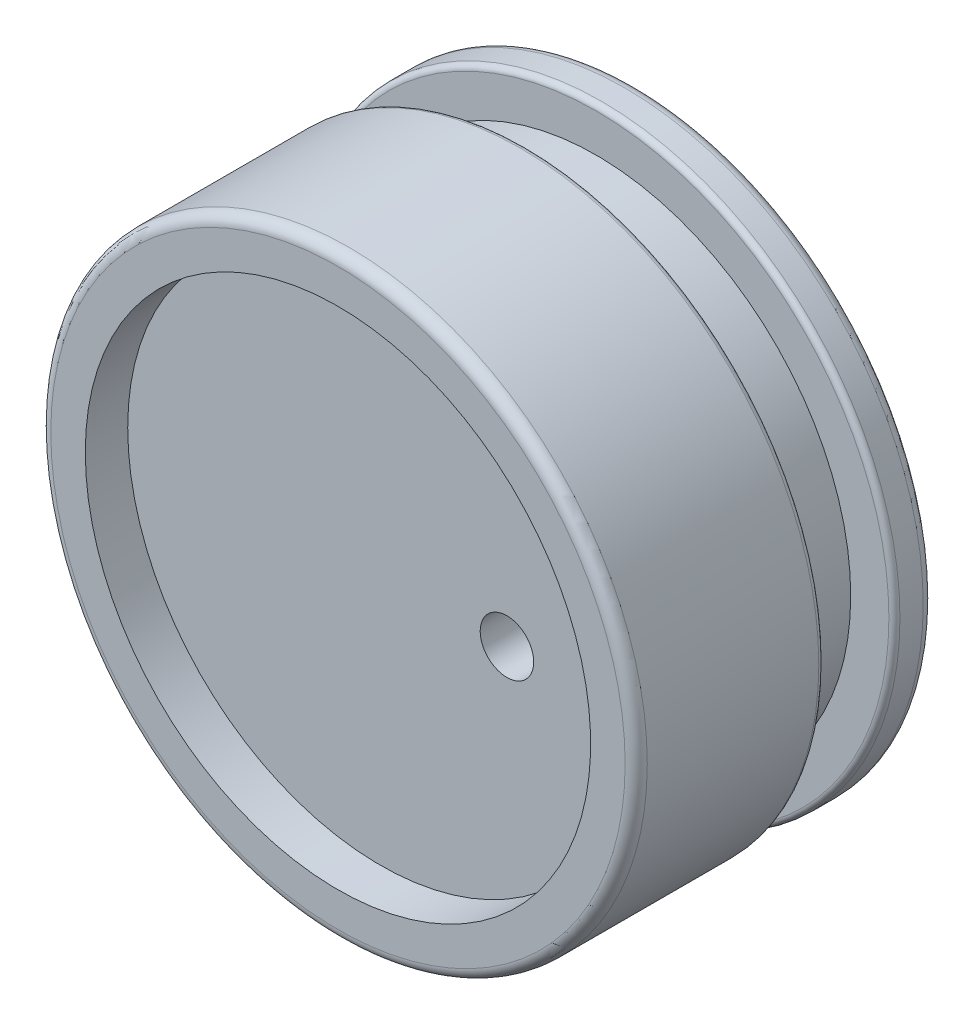
ISO-10303-21;
HEADER;
FILE_DESCRIPTION(('STEP AP214'),'2;1');
FILE_NAME('part.step','',(''),(''),'','','');
FILE_SCHEMA(('AUTOMOTIVE_DESIGN { 1 0 10303 214 1 1 1 1 }'));
ENDSEC;
DATA;
#1=APPLICATION_CONTEXT('core data for automotive mechanical design processes');
#2=APPLICATION_PROTOCOL_DEFINITION('international standard','automotive_design',2000,#1);
#3=PRODUCT_CONTEXT('',#1,'mechanical');
#4=PRODUCT('Part','Part','',(#3));
#5=PRODUCT_RELATED_PRODUCT_CATEGORY('part','',(#4));
#6=PRODUCT_DEFINITION_FORMATION('','',#4);
#7=PRODUCT_DEFINITION_CONTEXT('part definition',#1,'design');
#8=PRODUCT_DEFINITION('design','',#6,#7);
#9=PRODUCT_DEFINITION_SHAPE('','',#8);
#10=(LENGTH_UNIT() NAMED_UNIT(*) SI_UNIT(.MILLI.,.METRE.));
#11=(NAMED_UNIT(*) PLANE_ANGLE_UNIT() SI_UNIT($,.RADIAN.));
#12=(NAMED_UNIT(*) SI_UNIT($,.STERADIAN.) SOLID_ANGLE_UNIT());
#13=UNCERTAINTY_MEASURE_WITH_UNIT(LENGTH_MEASURE(1.E-05),#10,'distance_accuracy_value','');
#14=(GEOMETRIC_REPRESENTATION_CONTEXT(3) GLOBAL_UNCERTAINTY_ASSIGNED_CONTEXT((#13)) GLOBAL_UNIT_ASSIGNED_CONTEXT((#10,
#11,#12)) REPRESENTATION_CONTEXT('',''));
#15=CARTESIAN_POINT('',(0.,0.,0.));
#16=DIRECTION('',(0.,0.,1.));
#17=DIRECTION('',(1.,0.,0.));
#18=AXIS2_PLACEMENT_3D('',#15,#16,#17);
#19=CARTESIAN_POINT('',(8.7122,0.,3.2512));
#20=DIRECTION('',(0.,0.,1.));
#21=DIRECTION('',(0.,-1.,0.));
#22=AXIS2_PLACEMENT_3D('',#19,#20,#21);
#23=CONICAL_SURFACE('',#22,1.8415,1.02974425867666);
#24=CARTESIAN_POINT('',(8.7122,0.,2.14471517006075));
#25=VERTEX_POINT('',#24);
#26=VERTEX_LOOP('',#25);
#27=FACE_BOUND('',#26,.T.);
#28=CARTESIAN_POINT('',(8.7122,0.,3.2512));
#29=DIRECTION('',(0.,0.,1.));
#30=DIRECTION('',(0.,-1.,0.));
#31=AXIS2_PLACEMENT_3D('',#28,#29,#30);
#32=CIRCLE('',#31,1.8415);
#33=CARTESIAN_POINT('',(8.7122,-1.8415,3.2512));
#34=VERTEX_POINT('',#33);
#35=EDGE_CURVE('E354',#34,#34,#32,.T.);
#36=ORIENTED_EDGE('',*,*,#35,.T.);
#37=EDGE_LOOP('',(#36));
#38=FACE_BOUND('',#37,.T.);
#39=ADVANCED_FACE('F17',(#27,#38),#23,.F.);
#40=CARTESIAN_POINT('',(8.7122,0.,17.6022));
#41=DIRECTION('',(0.,0.,-1.));
#42=DIRECTION('',(-1.,0.,0.));
#43=AXIS2_PLACEMENT_3D('',#40,#41,#42);
#44=CYLINDRICAL_SURFACE('',#43,1.8415);
#45=CARTESIAN_POINT('',(8.7122,0.,17.6022));
#46=DIRECTION('',(0.,0.,-1.));
#47=DIRECTION('',(-1.,0.,0.));
#48=AXIS2_PLACEMENT_3D('',#45,#46,#47);
#49=CIRCLE('',#48,1.8415);
#50=CARTESIAN_POINT('',(6.8707,0.,17.6022));
#51=VERTEX_POINT('',#50);
#52=EDGE_CURVE('E361',#51,#51,#49,.T.);
#53=ORIENTED_EDGE('',*,*,#52,.F.);
#54=EDGE_LOOP('',(#53));
#55=FACE_BOUND('',#54,.T.);
#56=ORIENTED_EDGE('',*,*,#35,.F.);
#57=EDGE_LOOP('',(#56));
#58=FACE_BOUND('',#57,.T.);
#59=ADVANCED_FACE('F19',(#55,#58),#44,.F.);
#60=CARTESIAN_POINT('',(1.58172727272727,0.,17.6022));
#61=DIRECTION('',(0.,0.,1.));
#62=DIRECTION('',(1.,0.,0.));
#63=AXIS2_PLACEMENT_3D('',#60,#61,#62);
#64=PLANE('',#63);
#65=ORIENTED_EDGE('',*,*,#52,.T.);
#66=EDGE_LOOP('',(#65));
#67=FACE_BOUND('',#66,.T.);
#68=CARTESIAN_POINT('',(0.,0.,17.6022));
#69=DIRECTION('',(0.,0.,-1.));
#70=DIRECTION('',(-1.,0.,0.));
#71=AXIS2_PLACEMENT_3D('',#68,#69,#70);
#72=CIRCLE('',#71,17.399);
#73=CARTESIAN_POINT('',(-17.399,0.,17.6022));
#74=VERTEX_POINT('',#73);
#75=EDGE_CURVE('E358',#74,#74,#72,.F.);
#76=ORIENTED_EDGE('',*,*,#75,.T.);
#77=EDGE_LOOP('',(#76));
#78=FACE_BOUND('',#77,.T.);
#79=ADVANCED_FACE('F100',(#67,#78),#64,.T.);
#80=CARTESIAN_POINT('',(0.,0.,20.5232));
#81=DIRECTION('',(0.,0.,-1.));
#82=DIRECTION('',(-1.,0.,0.));
#83=AXIS2_PLACEMENT_3D('',#80,#81,#82);
#84=CYLINDRICAL_SURFACE('',#83,17.399);
#85=ORIENTED_EDGE('',*,*,#75,.F.);
#86=EDGE_LOOP('',(#85));
#87=FACE_BOUND('',#86,.T.);
#88=CARTESIAN_POINT('',(0.,0.,20.5232));
#89=DIRECTION('',(0.,0.,-1.));
#90=DIRECTION('',(-1.,0.,0.));
#91=AXIS2_PLACEMENT_3D('',#88,#89,#90);
#92=CIRCLE('',#91,17.399);
#93=CARTESIAN_POINT('',(-17.399,0.,20.5232));
#94=VERTEX_POINT('',#93);
#95=EDGE_CURVE('E70',#94,#94,#92,.T.);
#96=ORIENTED_EDGE('',*,*,#95,.F.);
#97=EDGE_LOOP('',(#96));
#98=FACE_BOUND('',#97,.T.);
#99=ADVANCED_FACE('F86',(#87,#98),#84,.F.);
#100=CARTESIAN_POINT('',(1.8669,0.,20.5232));
#101=DIRECTION('',(0.,0.,1.));
#102=DIRECTION('',(1.,0.,0.));
#103=AXIS2_PLACEMENT_3D('',#100,#101,#102);
#104=PLANE('',#103);
#105=ORIENTED_EDGE('',*,*,#95,.T.);
#106=EDGE_LOOP('',(#105));
#107=FACE_BOUND('',#106,.T.);
#108=CARTESIAN_POINT('',(0.,0.,20.5232));
#109=DIRECTION('',(0.,0.,-1.));
#110=DIRECTION('',(1.,0.,0.));
#111=AXIS2_PLACEMENT_3D('',#108,#109,#110);
#112=CIRCLE('',#111,19.7739);
#113=CARTESIAN_POINT('',(19.7739,0.,20.5232));
#114=VERTEX_POINT('',#113);
#115=CARTESIAN_POINT('',(-19.7739,0.,20.5232));
#116=VERTEX_POINT('',#115);
#117=EDGE_CURVE('E62',#114,#116,#112,.T.);
#118=ORIENTED_EDGE('',*,*,#117,.F.);
#119=CARTESIAN_POINT('',(0.,0.,20.5232));
#120=DIRECTION('',(0.,0.,-1.));
#121=DIRECTION('',(-1.,0.,0.));
#122=AXIS2_PLACEMENT_3D('',#119,#120,#121);
#123=CIRCLE('',#122,19.7739);
#124=EDGE_CURVE('E57',#116,#114,#123,.T.);
#125=ORIENTED_EDGE('',*,*,#124,.F.);
#126=EDGE_LOOP('',(#118,#125));
#127=FACE_BOUND('',#126,.T.);
#128=ADVANCED_FACE('F69',(#107,#127),#104,.T.);
#129=CARTESIAN_POINT('',(0.,0.,19.7612));
#130=DIRECTION('',(0.,0.,-1.));
#131=DIRECTION('',(-1.,0.,0.));
#132=AXIS2_PLACEMENT_3D('',#129,#130,#131);
#133=TOROIDAL_SURFACE('',#132,19.7739,0.762);
#134=ORIENTED_EDGE('',*,*,#117,.T.);
#135=ORIENTED_EDGE('',*,*,#124,.T.);
#136=EDGE_LOOP('',(#134,#135));
#137=FACE_BOUND('',#136,.T.);
#138=CARTESIAN_POINT('',(0.,0.,19.7612));
#139=DIRECTION('',(0.,0.,1.));
#140=DIRECTION('',(1.,0.,0.));
#141=AXIS2_PLACEMENT_3D('',#138,#139,#140);
#142=CIRCLE('',#141,20.5359);
#143=CARTESIAN_POINT('',(20.5359,0.,19.7612));
#144=VERTEX_POINT('',#143);
#145=EDGE_CURVE('E65',#144,#144,#142,.F.);
#146=ORIENTED_EDGE('',*,*,#145,.F.);
#147=EDGE_LOOP('',(#146));
#148=FACE_BOUND('',#147,.T.);
#149=ADVANCED_FACE('F60',(#137,#148),#133,.T.);
#150=CARTESIAN_POINT('',(0.,0.,7.5692));
#151=DIRECTION('',(0.,0.,1.));
#152=DIRECTION('',(1.,0.,0.));
#153=AXIS2_PLACEMENT_3D('',#150,#151,#152);
#154=CYLINDRICAL_SURFACE('',#153,20.5359);
#155=ORIENTED_EDGE('',*,*,#145,.T.);
#156=EDGE_LOOP('',(#155));
#157=FACE_BOUND('',#156,.T.);
#158=CARTESIAN_POINT('',(0.,0.,7.9502));
#159=DIRECTION('',(0.,0.,-1.));
#160=DIRECTION('',(-1.,0.,0.));
#161=AXIS2_PLACEMENT_3D('',#158,#159,#160);
#162=CIRCLE('',#161,20.5359);
#163=CARTESIAN_POINT('',(-20.5359,0.,7.9502));
#164=VERTEX_POINT('',#163);
#165=EDGE_CURVE('E223',#164,#164,#162,.T.);
#166=ORIENTED_EDGE('',*,*,#165,.F.);
#167=EDGE_LOOP('',(#166));
#168=FACE_BOUND('',#167,.T.);
#169=ADVANCED_FACE('F208',(#157,#168),#154,.T.);
#170=CARTESIAN_POINT('',(0.,0.,7.9502));
#171=DIRECTION('',(0.,0.,-1.));
#172=DIRECTION('',(-1.,0.,0.));
#173=AXIS2_PLACEMENT_3D('',#170,#171,#172);
#174=TOROIDAL_SURFACE('',#173,20.1549,0.381);
#175=ORIENTED_EDGE('',*,*,#165,.T.);
#176=EDGE_LOOP('',(#175));
#177=FACE_BOUND('',#176,.T.);
#178=CARTESIAN_POINT('',(0.,0.,7.5692));
#179=DIRECTION('',(0.,0.,1.));
#180=DIRECTION('',(1.,0.,0.));
#181=AXIS2_PLACEMENT_3D('',#178,#179,#180);
#182=CIRCLE('',#181,20.1549);
#183=CARTESIAN_POINT('',(20.1549,0.,7.5692));
#184=VERTEX_POINT('',#183);
#185=CARTESIAN_POINT('',(-20.1549,0.,7.5692));
#186=VERTEX_POINT('',#185);
#187=EDGE_CURVE('E219',#184,#186,#182,.T.);
#188=ORIENTED_EDGE('',*,*,#187,.T.);
#189=CARTESIAN_POINT('',(0.,0.,7.5692));
#190=DIRECTION('',(0.,0.,1.));
#191=DIRECTION('',(-1.,0.,0.));
#192=AXIS2_PLACEMENT_3D('',#189,#190,#191);
#193=CIRCLE('',#192,20.1549);
#194=EDGE_CURVE('E193',#186,#184,#193,.T.);
#195=ORIENTED_EDGE('',*,*,#194,.T.);
#196=EDGE_LOOP('',(#188,#195));
#197=FACE_BOUND('',#196,.T.);
#198=ADVANCED_FACE('F197',(#177,#197),#174,.T.);
#199=CARTESIAN_POINT('',(1.8669,0.,7.5692));
#200=DIRECTION('',(0.,0.,1.));
#201=DIRECTION('',(1.,0.,0.));
#202=AXIS2_PLACEMENT_3D('',#199,#200,#201);
#203=PLANE('',#202);
#204=CARTESIAN_POINT('',(0.,0.,7.5692));
#205=DIRECTION('',(0.,0.,1.));
#206=DIRECTION('',(1.,0.,0.));
#207=AXIS2_PLACEMENT_3D('',#204,#205,#206);
#208=CIRCLE('',#207,17.526);
#209=CARTESIAN_POINT('',(17.526,0.,7.5692));
#210=VERTEX_POINT('',#209);
#211=EDGE_CURVE('E349',#210,#210,#208,.F.);
#212=ORIENTED_EDGE('',*,*,#211,.F.);
#213=EDGE_LOOP('',(#212));
#214=FACE_BOUND('',#213,.T.);
#215=ORIENTED_EDGE('',*,*,#194,.F.);
#216=ORIENTED_EDGE('',*,*,#187,.F.);
#217=EDGE_LOOP('',(#215,#216));
#218=FACE_BOUND('',#217,.T.);
#219=ADVANCED_FACE('F207',(#214,#218),#203,.F.);
#220=CARTESIAN_POINT('',(0.,0.,2.7432));
#221=DIRECTION('',(0.,0.,1.));
#222=DIRECTION('',(1.,0.,0.));
#223=AXIS2_PLACEMENT_3D('',#220,#221,#222);
#224=CYLINDRICAL_SURFACE('',#223,17.526);
#225=ORIENTED_EDGE('',*,*,#211,.T.);
#226=EDGE_LOOP('',(#225));
#227=FACE_BOUND('',#226,.T.);
#228=CARTESIAN_POINT('',(0.,0.,2.7432));
#229=DIRECTION('',(0.,0.,1.));
#230=DIRECTION('',(1.,0.,0.));
#231=AXIS2_PLACEMENT_3D('',#228,#229,#230);
#232=CIRCLE('',#231,17.526);
#233=CARTESIAN_POINT('',(17.526,0.,2.7432));
#234=VERTEX_POINT('',#233);
#235=EDGE_CURVE('E345',#234,#234,#232,.F.);
#236=ORIENTED_EDGE('',*,*,#235,.F.);
#237=EDGE_LOOP('',(#236));
#238=FACE_BOUND('',#237,.T.);
#239=ADVANCED_FACE('F252',(#227,#238),#224,.T.);
#240=CARTESIAN_POINT('',(1.8669,0.,2.7432));
#241=DIRECTION('',(0.,0.,1.));
#242=DIRECTION('',(1.,0.,0.));
#243=AXIS2_PLACEMENT_3D('',#240,#241,#242);
#244=PLANE('',#243);
#245=ORIENTED_EDGE('',*,*,#235,.T.);
#246=EDGE_LOOP('',(#245));
#247=FACE_BOUND('',#246,.T.);
#248=CARTESIAN_POINT('',(0.,0.,2.7432));
#249=DIRECTION('',(0.,0.,-1.));
#250=DIRECTION('',(1.,0.,0.));
#251=AXIS2_PLACEMENT_3D('',#248,#249,#250);
#252=CIRCLE('',#251,20.1549);
#253=CARTESIAN_POINT('',(20.1549,0.,2.7432));
#254=VERTEX_POINT('',#253);
#255=CARTESIAN_POINT('',(-20.1549,0.,2.7432));
#256=VERTEX_POINT('',#255);
#257=EDGE_CURVE('E347',#254,#256,#252,.T.);
#258=ORIENTED_EDGE('',*,*,#257,.F.);
#259=CARTESIAN_POINT('',(0.,0.,2.7432));
#260=DIRECTION('',(0.,0.,-1.));
#261=DIRECTION('',(-1.,0.,0.));
#262=AXIS2_PLACEMENT_3D('',#259,#260,#261);
#263=CIRCLE('',#262,20.1549);
#264=EDGE_CURVE('E158',#256,#254,#263,.T.);
#265=ORIENTED_EDGE('',*,*,#264,.F.);
#266=EDGE_LOOP('',(#258,#265));
#267=FACE_BOUND('',#266,.T.);
#268=ADVANCED_FACE('F168',(#247,#267),#244,.T.);
#269=CARTESIAN_POINT('',(0.,0.,2.3622));
#270=DIRECTION('',(0.,0.,-1.));
#271=DIRECTION('',(-1.,0.,0.));
#272=AXIS2_PLACEMENT_3D('',#269,#270,#271);
#273=TOROIDAL_SURFACE('',#272,20.1549,0.381);
#274=ORIENTED_EDGE('',*,*,#257,.T.);
#275=ORIENTED_EDGE('',*,*,#264,.T.);
#276=EDGE_LOOP('',(#274,#275));
#277=FACE_BOUND('',#276,.T.);
#278=CARTESIAN_POINT('',(0.,0.,2.3622));
#279=DIRECTION('',(0.,0.,1.));
#280=DIRECTION('',(1.,0.,0.));
#281=AXIS2_PLACEMENT_3D('',#278,#279,#280);
#282=CIRCLE('',#281,20.5359);
#283=CARTESIAN_POINT('',(20.5359,0.,2.3622));
#284=VERTEX_POINT('',#283);
#285=EDGE_CURVE('E155',#284,#284,#282,.F.);
#286=ORIENTED_EDGE('',*,*,#285,.F.);
#287=EDGE_LOOP('',(#286));
#288=FACE_BOUND('',#287,.T.);
#289=ADVANCED_FACE('F164',(#277,#288),#273,.T.);
#290=CARTESIAN_POINT('',(0.,0.,0.));
#291=DIRECTION('',(0.,0.,1.));
#292=DIRECTION('',(1.,0.,0.));
#293=AXIS2_PLACEMENT_3D('',#290,#291,#292);
#294=CYLINDRICAL_SURFACE('',#293,20.5359);
#295=ORIENTED_EDGE('',*,*,#285,.T.);
#296=EDGE_LOOP('',(#295));
#297=FACE_BOUND('',#296,.T.);
#298=CARTESIAN_POINT('',(0.,0.,0.762));
#299=DIRECTION('',(0.,0.,-1.));
#300=DIRECTION('',(-1.,0.,0.));
#301=AXIS2_PLACEMENT_3D('',#298,#299,#300);
#302=CIRCLE('',#301,20.5359);
#303=CARTESIAN_POINT('',(-20.5359,0.,0.762));
#304=VERTEX_POINT('',#303);
#305=EDGE_CURVE('E147',#304,#304,#302,.T.);
#306=ORIENTED_EDGE('',*,*,#305,.F.);
#307=EDGE_LOOP('',(#306));
#308=FACE_BOUND('',#307,.T.);
#309=ADVANCED_FACE('F120',(#297,#308),#294,.T.);
#310=CARTESIAN_POINT('',(0.,0.,0.762));
#311=DIRECTION('',(0.,0.,-1.));
#312=DIRECTION('',(-1.,0.,0.));
#313=AXIS2_PLACEMENT_3D('',#310,#311,#312);
#314=TOROIDAL_SURFACE('',#313,19.7739,0.762);
#315=ORIENTED_EDGE('',*,*,#305,.T.);
#316=EDGE_LOOP('',(#315));
#317=FACE_BOUND('',#316,.T.);
#318=CARTESIAN_POINT('',(0.,0.,0.));
#319=DIRECTION('',(0.,0.,1.));
#320=DIRECTION('',(1.,0.,0.));
#321=AXIS2_PLACEMENT_3D('',#318,#319,#320);
#322=CIRCLE('',#321,19.7739);
#323=CARTESIAN_POINT('',(19.7739,0.,0.));
#324=VERTEX_POINT('',#323);
#325=CARTESIAN_POINT('',(-19.7739,0.,0.));
#326=VERTEX_POINT('',#325);
#327=EDGE_CURVE('E11',#324,#326,#322,.T.);
#328=ORIENTED_EDGE('',*,*,#327,.T.);
#329=CARTESIAN_POINT('',(0.,0.,0.));
#330=DIRECTION('',(0.,0.,1.));
#331=DIRECTION('',(-1.,0.,0.));
#332=AXIS2_PLACEMENT_3D('',#329,#330,#331);
#333=CIRCLE('',#332,19.7739);
#334=EDGE_CURVE('E29',#326,#324,#333,.T.);
#335=ORIENTED_EDGE('',*,*,#334,.T.);
#336=EDGE_LOOP('',(#328,#335));
#337=FACE_BOUND('',#336,.T.);
#338=ADVANCED_FACE('F115',(#317,#337),#314,.T.);
#339=CARTESIAN_POINT('',(1.8669,0.,0.));
#340=DIRECTION('',(0.,0.,1.));
#341=DIRECTION('',(1.,0.,0.));
#342=AXIS2_PLACEMENT_3D('',#339,#340,#341);
#343=PLANE('',#342);
#344=ORIENTED_EDGE('',*,*,#334,.F.);
#345=ORIENTED_EDGE('',*,*,#327,.F.);
#346=EDGE_LOOP('',(#344,#345));
#347=FACE_BOUND('',#346,.T.);
#348=ADVANCED_FACE('F113',(#347),#343,.F.);
#349=CLOSED_SHELL('',(#39,#59,#79,#99,#128,#149,#169,#198,#219,#239,#268,#289,#309,#338,#348));
#350=MANIFOLD_SOLID_BREP('B1',#349);
#351=ADVANCED_BREP_SHAPE_REPRESENTATION('',(#18,#350),#14);
#352=SHAPE_DEFINITION_REPRESENTATION(#9,#351);
ENDSEC;
END-ISO-10303-21;
